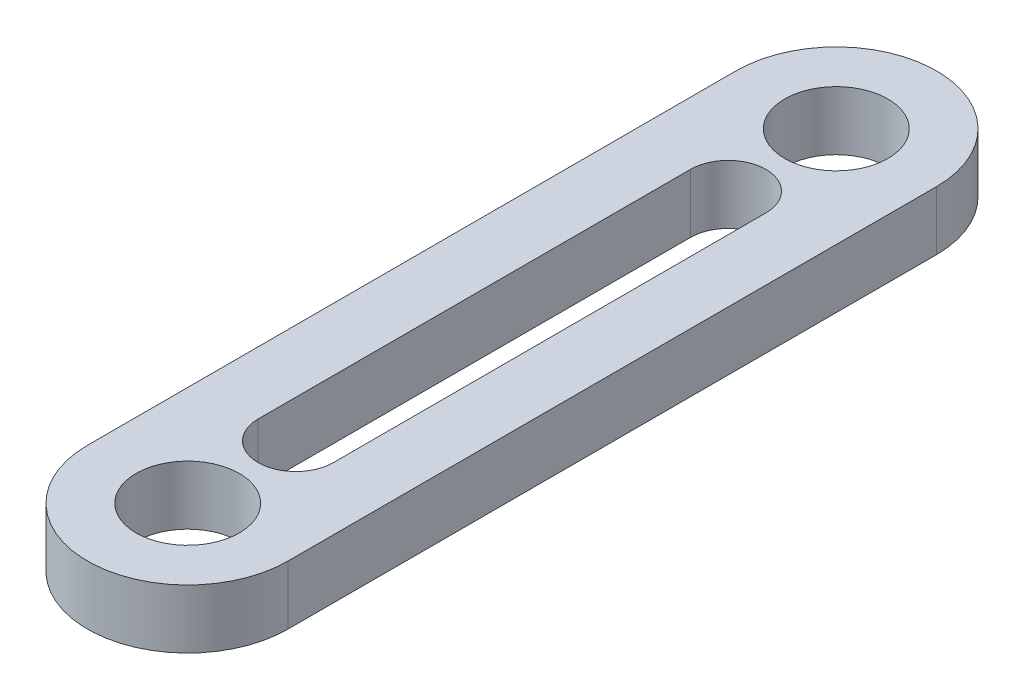
ISO-10303-21;
HEADER;
FILE_DESCRIPTION(('STEP AP214'),'2;1');
FILE_NAME('part.step','',(''),(''),'','','');
FILE_SCHEMA(('AUTOMOTIVE_DESIGN { 1 0 10303 214 1 1 1 1 }'));
ENDSEC;
DATA;
#1=APPLICATION_CONTEXT('core data for automotive mechanical design processes');
#2=APPLICATION_PROTOCOL_DEFINITION('international standard','automotive_design',2000,#1);
#3=PRODUCT_CONTEXT('',#1,'mechanical');
#4=PRODUCT('Part','Part','',(#3));
#5=PRODUCT_RELATED_PRODUCT_CATEGORY('part','',(#4));
#6=PRODUCT_DEFINITION_FORMATION('','',#4);
#7=PRODUCT_DEFINITION_CONTEXT('part definition',#1,'design');
#8=PRODUCT_DEFINITION('design','',#6,#7);
#9=PRODUCT_DEFINITION_SHAPE('','',#8);
#10=(LENGTH_UNIT() NAMED_UNIT(*) SI_UNIT(.MILLI.,.METRE.));
#11=(NAMED_UNIT(*) PLANE_ANGLE_UNIT() SI_UNIT($,.RADIAN.));
#12=(NAMED_UNIT(*) SI_UNIT($,.STERADIAN.) SOLID_ANGLE_UNIT());
#13=UNCERTAINTY_MEASURE_WITH_UNIT(LENGTH_MEASURE(1.E-05),#10,'distance_accuracy_value','');
#14=(GEOMETRIC_REPRESENTATION_CONTEXT(3) GLOBAL_UNCERTAINTY_ASSIGNED_CONTEXT((#13)) GLOBAL_UNIT_ASSIGNED_CONTEXT((#10,
#11,#12)) REPRESENTATION_CONTEXT('',''));
#15=CARTESIAN_POINT('',(0.,0.,0.));
#16=DIRECTION('',(0.,0.,1.));
#17=DIRECTION('',(1.,0.,0.));
#18=AXIS2_PLACEMENT_3D('',#15,#16,#17);
#19=CARTESIAN_POINT('',(0.,10.,18.3333333333333));
#20=DIRECTION('',(0.,-1.,0.));
#21=DIRECTION('',(0.,0.,-1.));
#22=AXIS2_PLACEMENT_3D('',#19,#20,#21);
#23=CYLINDRICAL_SURFACE('',#22,6.39610114993597);
#24=CARTESIAN_POINT('',(0.,0.,18.3333333333333));
#25=DIRECTION('',(0.,1.,0.));
#26=DIRECTION('',(0.,0.,1.));
#27=AXIS2_PLACEMENT_3D('',#24,#25,#26);
#28=CIRCLE('',#27,6.39610114993597);
#29=CARTESIAN_POINT('',(6.39610114993592,0.,18.3333333333333));
#30=VERTEX_POINT('',#29);
#31=CARTESIAN_POINT('',(-6.39610114993601,0.,18.3333333333333));
#32=VERTEX_POINT('',#31);
#33=EDGE_CURVE('E163',#30,#32,#28,.T.);
#34=ORIENTED_EDGE('',*,*,#33,.F.);
#35=DIRECTION('',(0.,-1.,0.));
#36=VECTOR('',#35,1.);
#37=CARTESIAN_POINT('',(6.39610114993592,10.,18.3333333333333));
#38=LINE('',#37,#36);
#39=CARTESIAN_POINT('',(6.39610114993592,10.,18.3333333333333));
#40=VERTEX_POINT('',#39);
#41=EDGE_CURVE('E11',#40,#30,#38,.T.);
#42=ORIENTED_EDGE('',*,*,#41,.F.);
#43=CARTESIAN_POINT('',(0.,10.,18.3333333333333));
#44=DIRECTION('',(0.,1.,0.));
#45=DIRECTION('',(0.,0.,1.));
#46=AXIS2_PLACEMENT_3D('',#43,#44,#45);
#47=CIRCLE('',#46,6.39610114993597);
#48=CARTESIAN_POINT('',(-6.39610114993601,10.,18.3333333333333));
#49=VERTEX_POINT('',#48);
#50=EDGE_CURVE('E137',#40,#49,#47,.T.);
#51=ORIENTED_EDGE('',*,*,#50,.T.);
#52=DIRECTION('',(0.,-1.,0.));
#53=VECTOR('',#52,1.);
#54=CARTESIAN_POINT('',(-6.39610114993601,10.,18.3333333333333));
#55=LINE('',#54,#53);
#56=EDGE_CURVE('E101',#49,#32,#55,.T.);
#57=ORIENTED_EDGE('',*,*,#56,.T.);
#58=EDGE_LOOP('',(#34,#42,#51,#57));
#59=FACE_BOUND('',#58,.T.);
#60=ADVANCED_FACE('F47',(#59),#23,.F.);
#61=CARTESIAN_POINT('',(6.39610114993592,10.,0.));
#62=DIRECTION('',(-1.,0.,0.));
#63=DIRECTION('',(0.,0.,1.));
#64=AXIS2_PLACEMENT_3D('',#61,#62,#63);
#65=PLANE('',#64);
#66=DIRECTION('',(0.,0.,-1.));
#67=VECTOR('',#66,1.);
#68=CARTESIAN_POINT('',(6.39610114993592,0.,0.));
#69=LINE('',#68,#67);
#70=CARTESIAN_POINT('',(6.39610114993594,0.,91.6666666666667));
#71=VERTEX_POINT('',#70);
#72=EDGE_CURVE('E128',#71,#30,#69,.T.);
#73=ORIENTED_EDGE('',*,*,#72,.F.);
#74=DIRECTION('',(0.,-1.,0.));
#75=VECTOR('',#74,1.);
#76=CARTESIAN_POINT('',(6.39610114993594,10.,91.6666666666667));
#77=LINE('',#76,#75);
#78=CARTESIAN_POINT('',(6.39610114993594,10.,91.6666666666667));
#79=VERTEX_POINT('',#78);
#80=EDGE_CURVE('E58',#79,#71,#77,.T.);
#81=ORIENTED_EDGE('',*,*,#80,.F.);
#82=DIRECTION('',(0.,0.,-1.));
#83=VECTOR('',#82,1.);
#84=CARTESIAN_POINT('',(6.39610114993592,10.,0.));
#85=LINE('',#84,#83);
#86=EDGE_CURVE('E126',#79,#40,#85,.T.);
#87=ORIENTED_EDGE('',*,*,#86,.T.);
#88=ORIENTED_EDGE('',*,*,#41,.T.);
#89=EDGE_LOOP('',(#73,#81,#87,#88));
#90=FACE_BOUND('',#89,.T.);
#91=ADVANCED_FACE('F125',(#90),#65,.T.);
#92=CARTESIAN_POINT('',(0.,10.,91.6666666666667));
#93=DIRECTION('',(0.,-1.,0.));
#94=DIRECTION('',(0.,0.,-1.));
#95=AXIS2_PLACEMENT_3D('',#92,#93,#94);
#96=CYLINDRICAL_SURFACE('',#95,6.39610114993597);
#97=CARTESIAN_POINT('',(0.,0.,91.6666666666667));
#98=DIRECTION('',(0.,1.,0.));
#99=DIRECTION('',(0.,0.,1.));
#100=AXIS2_PLACEMENT_3D('',#97,#98,#99);
#101=CIRCLE('',#100,6.39610114993597);
#102=CARTESIAN_POINT('',(-6.39610114993599,0.,91.6666666666667));
#103=VERTEX_POINT('',#102);
#104=EDGE_CURVE('E169',#103,#71,#101,.T.);
#105=ORIENTED_EDGE('',*,*,#104,.F.);
#106=DIRECTION('',(0.,-1.,0.));
#107=VECTOR('',#106,1.);
#108=CARTESIAN_POINT('',(-6.39610114993599,10.,91.6666666666667));
#109=LINE('',#108,#107);
#110=CARTESIAN_POINT('',(-6.39610114993599,10.,91.6666666666667));
#111=VERTEX_POINT('',#110);
#112=EDGE_CURVE('E94',#111,#103,#109,.T.);
#113=ORIENTED_EDGE('',*,*,#112,.F.);
#114=CARTESIAN_POINT('',(0.,10.,91.6666666666667));
#115=DIRECTION('',(0.,1.,0.));
#116=DIRECTION('',(0.,0.,1.));
#117=AXIS2_PLACEMENT_3D('',#114,#115,#116);
#118=CIRCLE('',#117,6.39610114993597);
#119=EDGE_CURVE('E136',#111,#79,#118,.T.);
#120=ORIENTED_EDGE('',*,*,#119,.T.);
#121=ORIENTED_EDGE('',*,*,#80,.T.);
#122=EDGE_LOOP('',(#105,#113,#120,#121));
#123=FACE_BOUND('',#122,.T.);
#124=ADVANCED_FACE('F140',(#123),#96,.F.);
#125=CARTESIAN_POINT('',(17.,10.,0.));
#126=DIRECTION('',(1.,0.,0.));
#127=DIRECTION('',(0.,0.,-1.));
#128=AXIS2_PLACEMENT_3D('',#125,#126,#127);
#129=PLANE('',#128);
#130=DIRECTION('',(0.,0.,1.));
#131=VECTOR('',#130,1.);
#132=CARTESIAN_POINT('',(17.,0.,0.));
#133=LINE('',#132,#131);
#134=CARTESIAN_POINT('',(17.,0.,0.));
#135=VERTEX_POINT('',#134);
#136=CARTESIAN_POINT('',(17.,0.,110.));
#137=VERTEX_POINT('',#136);
#138=EDGE_CURVE('E148',#135,#137,#133,.T.);
#139=ORIENTED_EDGE('',*,*,#138,.F.);
#140=DIRECTION('',(0.,-1.,0.));
#141=VECTOR('',#140,1.);
#142=CARTESIAN_POINT('',(17.,10.,0.));
#143=LINE('',#142,#141);
#144=CARTESIAN_POINT('',(17.,10.,0.));
#145=VERTEX_POINT('',#144);
#146=EDGE_CURVE('E51',#145,#135,#143,.T.);
#147=ORIENTED_EDGE('',*,*,#146,.F.);
#148=DIRECTION('',(0.,0.,1.));
#149=VECTOR('',#148,1.);
#150=CARTESIAN_POINT('',(17.,10.,0.));
#151=LINE('',#150,#149);
#152=CARTESIAN_POINT('',(17.,10.,110.));
#153=VERTEX_POINT('',#152);
#154=EDGE_CURVE('E175',#145,#153,#151,.T.);
#155=ORIENTED_EDGE('',*,*,#154,.T.);
#156=DIRECTION('',(0.,-1.,0.));
#157=VECTOR('',#156,1.);
#158=CARTESIAN_POINT('',(17.,10.,110.));
#159=LINE('',#158,#157);
#160=EDGE_CURVE('E144',#153,#137,#159,.T.);
#161=ORIENTED_EDGE('',*,*,#160,.T.);
#162=EDGE_LOOP('',(#139,#147,#155,#161));
#163=FACE_BOUND('',#162,.T.);
#164=ADVANCED_FACE('F49',(#163),#129,.T.);
#165=CARTESIAN_POINT('',(0.,10.,0.));
#166=DIRECTION('',(0.,-1.,0.));
#167=DIRECTION('',(0.,0.,-1.));
#168=AXIS2_PLACEMENT_3D('',#165,#166,#167);
#169=CYLINDRICAL_SURFACE('',#168,17.);
#170=CARTESIAN_POINT('',(0.,0.,0.));
#171=DIRECTION('',(0.,1.,0.));
#172=DIRECTION('',(0.,0.,1.));
#173=AXIS2_PLACEMENT_3D('',#170,#171,#172);
#174=CIRCLE('',#173,17.);
#175=CARTESIAN_POINT('',(-17.,0.,0.));
#176=VERTEX_POINT('',#175);
#177=EDGE_CURVE('E152',#135,#176,#174,.T.);
#178=ORIENTED_EDGE('',*,*,#177,.T.);
#179=DIRECTION('',(0.,-1.,0.));
#180=VECTOR('',#179,1.);
#181=CARTESIAN_POINT('',(-17.,10.,0.));
#182=LINE('',#181,#180);
#183=CARTESIAN_POINT('',(-17.,10.,0.));
#184=VERTEX_POINT('',#183);
#185=EDGE_CURVE('E185',#184,#176,#182,.T.);
#186=ORIENTED_EDGE('',*,*,#185,.F.);
#187=CARTESIAN_POINT('',(0.,10.,0.));
#188=DIRECTION('',(0.,1.,0.));
#189=DIRECTION('',(0.,0.,1.));
#190=AXIS2_PLACEMENT_3D('',#187,#188,#189);
#191=CIRCLE('',#190,17.);
#192=EDGE_CURVE('E196',#145,#184,#191,.T.);
#193=ORIENTED_EDGE('',*,*,#192,.F.);
#194=ORIENTED_EDGE('',*,*,#146,.T.);
#195=EDGE_LOOP('',(#178,#186,#193,#194));
#196=FACE_BOUND('',#195,.T.);
#197=ADVANCED_FACE('F195',(#196),#169,.T.);
#198=CARTESIAN_POINT('',(-17.,10.,0.));
#199=DIRECTION('',(1.,0.,0.));
#200=DIRECTION('',(0.,0.,-1.));
#201=AXIS2_PLACEMENT_3D('',#198,#199,#200);
#202=PLANE('',#201);
#203=DIRECTION('',(0.,0.,1.));
#204=VECTOR('',#203,1.);
#205=CARTESIAN_POINT('',(-17.,0.,0.));
#206=LINE('',#205,#204);
#207=CARTESIAN_POINT('',(-16.9999999999999,0.,110.));
#208=VERTEX_POINT('',#207);
#209=EDGE_CURVE('E156',#176,#208,#206,.T.);
#210=ORIENTED_EDGE('',*,*,#209,.T.);
#211=DIRECTION('',(0.,-1.,0.));
#212=VECTOR('',#211,1.);
#213=CARTESIAN_POINT('',(-16.9999999999999,10.,110.));
#214=LINE('',#213,#212);
#215=CARTESIAN_POINT('',(-16.9999999999999,10.,110.));
#216=VERTEX_POINT('',#215);
#217=EDGE_CURVE('E182',#216,#208,#214,.T.);
#218=ORIENTED_EDGE('',*,*,#217,.F.);
#219=DIRECTION('',(0.,0.,1.));
#220=VECTOR('',#219,1.);
#221=CARTESIAN_POINT('',(-17.,10.,0.));
#222=LINE('',#221,#220);
#223=EDGE_CURVE('E209',#184,#216,#222,.T.);
#224=ORIENTED_EDGE('',*,*,#223,.F.);
#225=ORIENTED_EDGE('',*,*,#185,.T.);
#226=EDGE_LOOP('',(#210,#218,#224,#225));
#227=FACE_BOUND('',#226,.T.);
#228=ADVANCED_FACE('F208',(#227),#202,.F.);
#229=CARTESIAN_POINT('',(0.,10.,110.));
#230=DIRECTION('',(0.,-1.,0.));
#231=DIRECTION('',(0.,0.,-1.));
#232=AXIS2_PLACEMENT_3D('',#229,#230,#231);
#233=CYLINDRICAL_SURFACE('',#232,17.);
#234=CARTESIAN_POINT('',(0.,0.,110.));
#235=DIRECTION('',(0.,1.,0.));
#236=DIRECTION('',(0.,0.,1.));
#237=AXIS2_PLACEMENT_3D('',#234,#235,#236);
#238=CIRCLE('',#237,17.);
#239=EDGE_CURVE('E159',#208,#137,#238,.T.);
#240=ORIENTED_EDGE('',*,*,#239,.T.);
#241=ORIENTED_EDGE('',*,*,#160,.F.);
#242=CARTESIAN_POINT('',(0.,10.,110.));
#243=DIRECTION('',(0.,1.,0.));
#244=DIRECTION('',(0.,0.,1.));
#245=AXIS2_PLACEMENT_3D('',#242,#243,#244);
#246=CIRCLE('',#245,17.);
#247=EDGE_CURVE('E207',#216,#153,#246,.T.);
#248=ORIENTED_EDGE('',*,*,#247,.F.);
#249=ORIENTED_EDGE('',*,*,#217,.T.);
#250=EDGE_LOOP('',(#240,#241,#248,#249));
#251=FACE_BOUND('',#250,.T.);
#252=ADVANCED_FACE('F205',(#251),#233,.T.);
#253=CARTESIAN_POINT('',(-6.39610114993602,10.,0.));
#254=DIRECTION('',(-1.,0.,0.));
#255=DIRECTION('',(0.,0.,1.));
#256=AXIS2_PLACEMENT_3D('',#253,#254,#255);
#257=PLANE('',#256);
#258=DIRECTION('',(0.,0.,-1.));
#259=VECTOR('',#258,1.);
#260=CARTESIAN_POINT('',(-6.39610114993602,0.,0.));
#261=LINE('',#260,#259);
#262=EDGE_CURVE('E172',#103,#32,#261,.T.);
#263=ORIENTED_EDGE('',*,*,#262,.T.);
#264=ORIENTED_EDGE('',*,*,#56,.F.);
#265=DIRECTION('',(0.,0.,-1.));
#266=VECTOR('',#265,1.);
#267=CARTESIAN_POINT('',(-6.39610114993602,10.,0.));
#268=LINE('',#267,#266);
#269=EDGE_CURVE('E67',#111,#49,#268,.T.);
#270=ORIENTED_EDGE('',*,*,#269,.F.);
#271=ORIENTED_EDGE('',*,*,#112,.T.);
#272=EDGE_LOOP('',(#263,#264,#270,#271));
#273=FACE_BOUND('',#272,.T.);
#274=ADVANCED_FACE('F219',(#273),#257,.F.);
#275=CARTESIAN_POINT('',(0.,10.,0.));
#276=DIRECTION('',(0.,1.,0.));
#277=DIRECTION('',(0.,0.,1.));
#278=AXIS2_PLACEMENT_3D('',#275,#276,#277);
#279=PLANE('',#278);
#280=CARTESIAN_POINT('',(0.,10.,110.));
#281=DIRECTION('',(0.,1.,0.));
#282=DIRECTION('',(0.,0.,1.));
#283=AXIS2_PLACEMENT_3D('',#280,#281,#282);
#284=CIRCLE('',#283,8.74999999999999);
#285=CARTESIAN_POINT('',(0.,10.,118.75));
#286=VERTEX_POINT('',#285);
#287=EDGE_CURVE('E330',#286,#286,#284,.T.);
#288=ORIENTED_EDGE('',*,*,#287,.F.);
#289=EDGE_LOOP('',(#288));
#290=FACE_BOUND('',#289,.T.);
#291=CARTESIAN_POINT('',(0.,10.,0.));
#292=DIRECTION('',(0.,1.,0.));
#293=DIRECTION('',(0.,0.,1.));
#294=AXIS2_PLACEMENT_3D('',#291,#292,#293);
#295=CIRCLE('',#294,8.74999999999999);
#296=CARTESIAN_POINT('',(0.,10.,8.74999999999999));
#297=VERTEX_POINT('',#296);
#298=EDGE_CURVE('E334',#297,#297,#295,.T.);
#299=ORIENTED_EDGE('',*,*,#298,.F.);
#300=EDGE_LOOP('',(#299));
#301=FACE_BOUND('',#300,.T.);
#302=ORIENTED_EDGE('',*,*,#154,.F.);
#303=ORIENTED_EDGE('',*,*,#192,.T.);
#304=ORIENTED_EDGE('',*,*,#223,.T.);
#305=ORIENTED_EDGE('',*,*,#247,.T.);
#306=EDGE_LOOP('',(#302,#303,#304,#305));
#307=FACE_BOUND('',#306,.T.);
#308=ORIENTED_EDGE('',*,*,#50,.F.);
#309=ORIENTED_EDGE('',*,*,#86,.F.);
#310=ORIENTED_EDGE('',*,*,#119,.F.);
#311=ORIENTED_EDGE('',*,*,#269,.T.);
#312=EDGE_LOOP('',(#308,#309,#310,#311));
#313=FACE_BOUND('',#312,.T.);
#314=ADVANCED_FACE('F135',(#290,#301,#307,#313),#279,.T.);
#315=CARTESIAN_POINT('',(0.,0.,0.));
#316=DIRECTION('',(0.,1.,0.));
#317=DIRECTION('',(0.,0.,1.));
#318=AXIS2_PLACEMENT_3D('',#315,#316,#317);
#319=PLANE('',#318);
#320=CARTESIAN_POINT('',(0.,0.,110.));
#321=DIRECTION('',(0.,1.,0.));
#322=DIRECTION('',(0.,0.,1.));
#323=AXIS2_PLACEMENT_3D('',#320,#321,#322);
#324=CIRCLE('',#323,8.75);
#325=CARTESIAN_POINT('',(0.,0.,118.75));
#326=VERTEX_POINT('',#325);
#327=EDGE_CURVE('E327',#326,#326,#324,.T.);
#328=ORIENTED_EDGE('',*,*,#327,.T.);
#329=EDGE_LOOP('',(#328));
#330=FACE_BOUND('',#329,.T.);
#331=CARTESIAN_POINT('',(0.,0.,0.));
#332=DIRECTION('',(0.,1.,0.));
#333=DIRECTION('',(0.,0.,1.));
#334=AXIS2_PLACEMENT_3D('',#331,#332,#333);
#335=CIRCLE('',#334,8.75);
#336=CARTESIAN_POINT('',(0.,0.,8.75));
#337=VERTEX_POINT('',#336);
#338=EDGE_CURVE('E153',#337,#337,#335,.T.);
#339=ORIENTED_EDGE('',*,*,#338,.T.);
#340=EDGE_LOOP('',(#339));
#341=FACE_BOUND('',#340,.T.);
#342=ORIENTED_EDGE('',*,*,#138,.T.);
#343=ORIENTED_EDGE('',*,*,#239,.F.);
#344=ORIENTED_EDGE('',*,*,#209,.F.);
#345=ORIENTED_EDGE('',*,*,#177,.F.);
#346=EDGE_LOOP('',(#342,#343,#344,#345));
#347=FACE_BOUND('',#346,.T.);
#348=ORIENTED_EDGE('',*,*,#33,.T.);
#349=ORIENTED_EDGE('',*,*,#262,.F.);
#350=ORIENTED_EDGE('',*,*,#104,.T.);
#351=ORIENTED_EDGE('',*,*,#72,.T.);
#352=EDGE_LOOP('',(#348,#349,#350,#351));
#353=FACE_BOUND('',#352,.T.);
#354=ADVANCED_FACE('F199',(#330,#341,#347,#353),#319,.F.);
#355=CARTESIAN_POINT('',(0.,10.,0.));
#356=DIRECTION('',(0.,1.,0.));
#357=DIRECTION('',(0.,0.,1.));
#358=AXIS2_PLACEMENT_3D('',#355,#356,#357);
#359=CYLINDRICAL_SURFACE('',#358,8.74999999999999);
#360=ORIENTED_EDGE('',*,*,#338,.F.);
#361=EDGE_LOOP('',(#360));
#362=FACE_BOUND('',#361,.T.);
#363=ORIENTED_EDGE('',*,*,#298,.T.);
#364=EDGE_LOOP('',(#363));
#365=FACE_BOUND('',#364,.T.);
#366=ADVANCED_FACE('F295',(#362,#365),#359,.F.);
#367=CARTESIAN_POINT('',(0.,10.,110.));
#368=DIRECTION('',(0.,1.,0.));
#369=DIRECTION('',(0.,0.,1.));
#370=AXIS2_PLACEMENT_3D('',#367,#368,#369);
#371=CYLINDRICAL_SURFACE('',#370,8.74999999999999);
#372=ORIENTED_EDGE('',*,*,#327,.F.);
#373=EDGE_LOOP('',(#372));
#374=FACE_BOUND('',#373,.T.);
#375=ORIENTED_EDGE('',*,*,#287,.T.);
#376=EDGE_LOOP('',(#375));
#377=FACE_BOUND('',#376,.T.);
#378=ADVANCED_FACE('F304',(#374,#377),#371,.F.);
#379=CLOSED_SHELL('',(#60,#91,#124,#164,#197,#228,#252,#274,#314,#354,#366,#378));
#380=MANIFOLD_SOLID_BREP('B2',#379);
#381=ADVANCED_BREP_SHAPE_REPRESENTATION('',(#18,#380),#14);
#382=SHAPE_DEFINITION_REPRESENTATION(#9,#381);
ENDSEC;
END-ISO-10303-21;
